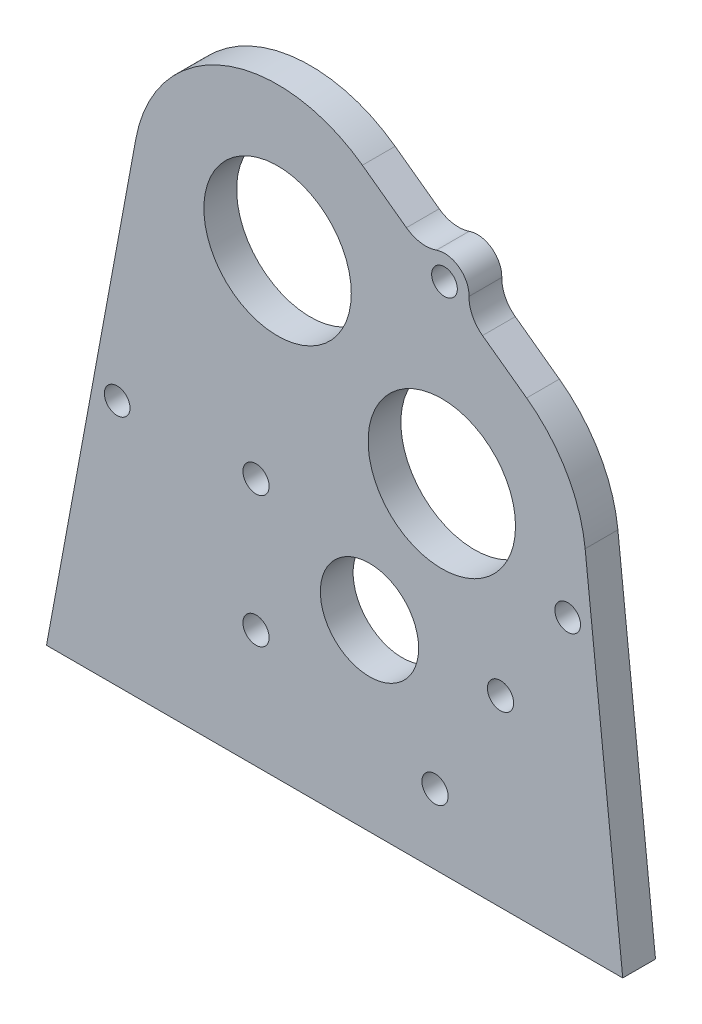
ISO-10303-21;
HEADER;
FILE_DESCRIPTION(('STEP AP214'),'2;1');
FILE_NAME('part.step','',(''),(''),'','','');
FILE_SCHEMA(('AUTOMOTIVE_DESIGN { 1 0 10303 214 1 1 1 1 }'));
ENDSEC;
DATA;
#1=APPLICATION_CONTEXT('core data for automotive mechanical design processes');
#2=APPLICATION_PROTOCOL_DEFINITION('international standard','automotive_design',2000,#1);
#3=PRODUCT_CONTEXT('',#1,'mechanical');
#4=PRODUCT('Part','Part','',(#3));
#5=PRODUCT_RELATED_PRODUCT_CATEGORY('part','',(#4));
#6=PRODUCT_DEFINITION_FORMATION('','',#4);
#7=PRODUCT_DEFINITION_CONTEXT('part definition',#1,'design');
#8=PRODUCT_DEFINITION('design','',#6,#7);
#9=PRODUCT_DEFINITION_SHAPE('','',#8);
#10=(LENGTH_UNIT() NAMED_UNIT(*) SI_UNIT(.MILLI.,.METRE.));
#11=(NAMED_UNIT(*) PLANE_ANGLE_UNIT() SI_UNIT($,.RADIAN.));
#12=(NAMED_UNIT(*) SI_UNIT($,.STERADIAN.) SOLID_ANGLE_UNIT());
#13=UNCERTAINTY_MEASURE_WITH_UNIT(LENGTH_MEASURE(1.E-05),#10,'distance_accuracy_value','');
#14=(GEOMETRIC_REPRESENTATION_CONTEXT(3) GLOBAL_UNCERTAINTY_ASSIGNED_CONTEXT((#13)) GLOBAL_UNIT_ASSIGNED_CONTEXT((#10,
#11,#12)) REPRESENTATION_CONTEXT('',''));
#15=CARTESIAN_POINT('',(0.,0.,0.));
#16=DIRECTION('',(0.,0.,1.));
#17=DIRECTION('',(1.,0.,0.));
#18=AXIS2_PLACEMENT_3D('',#15,#16,#17);
#19=CARTESIAN_POINT('',(0.,0.,-3.175));
#20=DIRECTION('',(0.,0.,1.));
#21=DIRECTION('',(1.,0.,0.));
#22=AXIS2_PLACEMENT_3D('',#19,#20,#21);
#23=PLANE('',#22);
#24=CARTESIAN_POINT('',(357.900203683853,107.288954743875,-3.175));
#25=DIRECTION('',(0.,0.,1.));
#26=DIRECTION('',(1.,0.,0.));
#27=AXIS2_PLACEMENT_3D('',#24,#25,#26);
#28=CIRCLE('',#27,2.54000000000001);
#29=CARTESIAN_POINT('',(360.440203683853,107.288954743875,-3.175));
#30=VERTEX_POINT('',#29);
#31=EDGE_CURVE('E529',#30,#30,#28,.T.);
#32=ORIENTED_EDGE('',*,*,#31,.T.);
#33=EDGE_LOOP('',(#32));
#34=FACE_BOUND('',#33,.T.);
#35=CARTESIAN_POINT('',(323.203158427728,141.986,-3.175));
#36=DIRECTION('',(0.,0.,1.));
#37=DIRECTION('',(1.,0.,0.));
#38=AXIS2_PLACEMENT_3D('',#35,#36,#37);
#39=CIRCLE('',#38,2.54000000000001);
#40=CARTESIAN_POINT('',(325.743158427728,141.986,-3.175));
#41=VERTEX_POINT('',#40);
#42=EDGE_CURVE('E515',#41,#41,#39,.T.);
#43=ORIENTED_EDGE('',*,*,#42,.T.);
#44=EDGE_LOOP('',(#43));
#45=FACE_BOUND('',#44,.T.);
#46=CARTESIAN_POINT('',(345.200203683853,129.286,-3.175));
#47=DIRECTION('',(0.,0.,1.));
#48=DIRECTION('',(1.,0.,0.));
#49=AXIS2_PLACEMENT_3D('',#46,#47,#48);
#50=CIRCLE('',#49,9.52500000000002);
#51=CARTESIAN_POINT('',(354.725203683853,129.286,-3.175));
#52=VERTEX_POINT('',#51);
#53=EDGE_CURVE('E520',#52,#52,#50,.T.);
#54=ORIENTED_EDGE('',*,*,#53,.T.);
#55=EDGE_LOOP('',(#54));
#56=FACE_BOUND('',#55,.T.);
#57=CARTESIAN_POINT('',(359.220787339553,159.181545386454,-3.175));
#58=DIRECTION('',(0.,0.,1.));
#59=DIRECTION('',(1.,0.,0.));
#60=AXIS2_PLACEMENT_3D('',#57,#58,#59);
#61=CIRCLE('',#60,14.2875);
#62=CARTESIAN_POINT('',(373.508287339553,159.181545386454,-3.175));
#63=VERTEX_POINT('',#62);
#64=EDGE_CURVE('E535',#63,#63,#61,.T.);
#65=ORIENTED_EDGE('',*,*,#64,.T.);
#66=EDGE_LOOP('',(#65));
#67=FACE_BOUND('',#66,.T.);
#68=CARTESIAN_POINT('',(359.736930032377,193.355752351951,-3.175));
#69=DIRECTION('',(0.,0.,1.));
#70=DIRECTION('',(1.,0.,0.));
#71=AXIS2_PLACEMENT_3D('',#68,#69,#70);
#72=CIRCLE('',#71,2.48919999999995);
#73=CARTESIAN_POINT('',(362.226130032377,193.355752351951,-3.175));
#74=VERTEX_POINT('',#73);
#75=EDGE_CURVE('E582',#74,#74,#72,.T.);
#76=ORIENTED_EDGE('',*,*,#75,.T.);
#77=EDGE_LOOP('',(#76));
#78=FACE_BOUND('',#77,.T.);
#79=CARTESIAN_POINT('',(323.203158427728,116.586,-3.175));
#80=DIRECTION('',(0.,0.,1.));
#81=DIRECTION('',(1.,0.,0.));
#82=AXIS2_PLACEMENT_3D('',#79,#80,#81);
#83=CIRCLE('',#82,2.54000000000001);
#84=CARTESIAN_POINT('',(325.743158427728,116.586,-3.175));
#85=VERTEX_POINT('',#84);
#86=EDGE_CURVE('E579',#85,#85,#83,.T.);
#87=ORIENTED_EDGE('',*,*,#86,.T.);
#88=EDGE_LOOP('',(#87));
#89=FACE_BOUND('',#88,.T.);
#90=CARTESIAN_POINT('',(370.600203683853,129.286,-3.175));
#91=DIRECTION('',(0.,0.,1.));
#92=DIRECTION('',(1.,0.,0.));
#93=AXIS2_PLACEMENT_3D('',#90,#91,#92);
#94=CIRCLE('',#93,2.54000000000001);
#95=CARTESIAN_POINT('',(373.140203683853,129.286,-3.175));
#96=VERTEX_POINT('',#95);
#97=EDGE_CURVE('E572',#96,#96,#94,.T.);
#98=ORIENTED_EDGE('',*,*,#97,.T.);
#99=EDGE_LOOP('',(#98));
#100=FACE_BOUND('',#99,.T.);
#101=CARTESIAN_POINT('',(383.622054767401,148.927754779996,-3.175));
#102=DIRECTION('',(0.,0.,1.));
#103=DIRECTION('',(1.,0.,0.));
#104=AXIS2_PLACEMENT_3D('',#101,#102,#103);
#105=CIRCLE('',#104,2.48919999999995);
#106=CARTESIAN_POINT('',(386.111254767401,148.927754779996,-3.175));
#107=VERTEX_POINT('',#106);
#108=EDGE_CURVE('E573',#107,#107,#105,.T.);
#109=ORIENTED_EDGE('',*,*,#108,.T.);
#110=EDGE_LOOP('',(#109));
#111=FACE_BOUND('',#110,.T.);
#112=CARTESIAN_POINT('',(327.382606343257,182.340283064642,-3.175));
#113=DIRECTION('',(0.,0.,1.));
#114=DIRECTION('',(1.,0.,0.));
#115=AXIS2_PLACEMENT_3D('',#112,#113,#114);
#116=CIRCLE('',#115,14.2875000000001);
#117=CARTESIAN_POINT('',(341.670106343257,182.340283064642,-3.175));
#118=VERTEX_POINT('',#117);
#119=EDGE_CURVE('E209',#118,#118,#116,.T.);
#120=ORIENTED_EDGE('',*,*,#119,.T.);
#121=EDGE_LOOP('',(#120));
#122=FACE_BOUND('',#121,.T.);
#123=CARTESIAN_POINT('',(359.736930032377,193.355752351951,-3.175));
#124=DIRECTION('',(0.,0.,1.));
#125=DIRECTION('',(1.,0.,0.));
#126=AXIS2_PLACEMENT_3D('',#123,#124,#125);
#127=CIRCLE('',#126,4.76250000000001);
#128=CARTESIAN_POINT('',(364.498416944781,193.257524896504,-3.175));
#129=VERTEX_POINT('',#128);
#130=CARTESIAN_POINT('',(358.177111923409,197.855571650205,-3.175));
#131=VERTEX_POINT('',#130);
#132=EDGE_CURVE('E187',#129,#131,#127,.T.);
#133=ORIENTED_EDGE('',*,*,#132,.F.);
#134=CARTESIAN_POINT('',(370.84706616132,193.126554955907,-3.175));
#135=DIRECTION('',(0.,0.,1.));
#136=DIRECTION('',(1.,0.,0.));
#137=AXIS2_PLACEMENT_3D('',#134,#135,#136);
#138=CIRCLE('',#137,6.35);
#139=CARTESIAN_POINT('',(367.111785890645,187.991364472633,-3.175));
#140=VERTEX_POINT('',#139);
#141=EDGE_CURVE('E88',#129,#140,#138,.T.);
#142=ORIENTED_EDGE('',*,*,#141,.T.);
#143=DIRECTION('',(0.80869141468874,-0.588233113492198,0.));
#144=VECTOR('',#143,1.);
#145=CARTESIAN_POINT('',(216.454674820426,297.577666373321,-3.175));
#146=LINE('',#145,#144);
#147=CARTESIAN_POINT('',(375.656020530525,181.776383512857,-3.175));
#148=VERTEX_POINT('',#147);
#149=EDGE_CURVE('E210',#140,#148,#146,.T.);
#150=ORIENTED_EDGE('',*,*,#149,.T.);
#151=CARTESIAN_POINT('',(359.220787339553,159.181545386454,-3.175));
#152=DIRECTION('',(0.,0.,1.));
#153=DIRECTION('',(1.,0.,0.));
#154=AXIS2_PLACEMENT_3D('',#151,#152,#153);
#155=CIRCLE('',#154,27.94);
#156=CARTESIAN_POINT('',(387.00351783802,162.141863958766,-3.175));
#157=VERTEX_POINT('',#156);
#158=EDGE_CURVE('E221',#157,#148,#155,.T.);
#159=ORIENTED_EDGE('',*,*,#158,.F.);
#160=DIRECTION('',(-0.105952704807169,0.994371170310184,0.));
#161=VECTOR('',#160,1.);
#162=CARTESIAN_POINT('',(399.741695074354,42.5934651787206,-3.175));
#163=LINE('',#162,#161);
#164=CARTESIAN_POINT('',(394.293397165363,93.726,-3.175));
#165=VERTEX_POINT('',#164);
#166=EDGE_CURVE('E218',#165,#157,#163,.T.);
#167=ORIENTED_EDGE('',*,*,#166,.F.);
#168=DIRECTION('',(1.,0.,0.));
#169=VECTOR('',#168,1.);
#170=CARTESIAN_POINT('',(0.,93.726,-3.175));
#171=LINE('',#170,#169);
#172=CARTESIAN_POINT('',(282.588037109009,93.726,-3.175));
#173=VERTEX_POINT('',#172);
#174=EDGE_CURVE('E215',#173,#165,#171,.T.);
#175=ORIENTED_EDGE('',*,*,#174,.F.);
#176=DIRECTION('',(0.181779511053592,0.983339315476157,0.));
#177=VECTOR('',#176,1.);
#178=CARTESIAN_POINT('',(256.496646574376,-47.4158149352533,-3.175));
#179=LINE('',#178,#177);
#180=CARTESIAN_POINT('',(299.908105868854,187.419202603479,-3.175));
#181=VERTEX_POINT('',#180);
#182=EDGE_CURVE('E212',#173,#181,#179,.T.);
#183=ORIENTED_EDGE('',*,*,#182,.T.);
#184=CARTESIAN_POINT('',(327.382606343257,182.340283064642,-3.175));
#185=DIRECTION('',(0.,0.,1.));
#186=DIRECTION('',(1.,0.,0.));
#187=AXIS2_PLACEMENT_3D('',#184,#185,#186);
#188=CIRCLE('',#187,27.94);
#189=CARTESIAN_POINT('',(343.817839534229,204.935121191045,-3.175));
#190=VERTEX_POINT('',#189);
#191=EDGE_CURVE('E208',#190,#181,#188,.T.);
#192=ORIENTED_EDGE('',*,*,#191,.F.);
#193=CARTESIAN_POINT('',(352.36207417411,198.720140231269,-3.175));
#194=VERTEX_POINT('',#193);
#195=EDGE_CURVE('E163',#190,#194,#146,.T.);
#196=ORIENTED_EDGE('',*,*,#195,.T.);
#197=CARTESIAN_POINT('',(356.097354444785,203.855330714543,-3.175));
#198=DIRECTION('',(0.,0.,1.));
#199=DIRECTION('',(1.,0.,0.));
#200=AXIS2_PLACEMENT_3D('',#197,#198,#199);
#201=CIRCLE('',#200,6.35);
#202=EDGE_CURVE('E243',#194,#131,#201,.T.);
#203=ORIENTED_EDGE('',*,*,#202,.T.);
#204=EDGE_LOOP('',(#133,#142,#150,#159,#167,#175,#183,#192,#196,#203));
#205=FACE_BOUND('',#204,.T.);
#206=CARTESIAN_POINT('',(296.287104949656,141.632015054224,-3.175));
#207=DIRECTION('',(0.,0.,1.));
#208=DIRECTION('',(1.,0.,0.));
#209=AXIS2_PLACEMENT_3D('',#206,#207,#208);
#210=CIRCLE('',#209,2.48919999999995);
#211=CARTESIAN_POINT('',(298.776304949656,141.632015054224,-3.175));
#212=VERTEX_POINT('',#211);
#213=EDGE_CURVE('E183',#212,#212,#210,.T.);
#214=ORIENTED_EDGE('',*,*,#213,.T.);
#215=EDGE_LOOP('',(#214));
#216=FACE_BOUND('',#215,.T.);
#217=ADVANCED_FACE('F80',(#34,#45,#56,#67,#78,#89,#100,#111,#122,#205,#216),#23,.F.);
#218=CARTESIAN_POINT('',(359.736930032377,193.355752351951,3.175));
#219=DIRECTION('',(0.,0.,-1.));
#220=DIRECTION('',(-1.,0.,0.));
#221=AXIS2_PLACEMENT_3D('',#218,#219,#220);
#222=CYLINDRICAL_SURFACE('',#221,4.76250000000001);
#223=ORIENTED_EDGE('',*,*,#132,.T.);
#224=DIRECTION('',(0.,0.,-1.));
#225=VECTOR('',#224,1.);
#226=CARTESIAN_POINT('',(358.177111923409,197.855571650205,3.175));
#227=LINE('',#226,#225);
#228=CARTESIAN_POINT('',(358.177111923409,197.855571650205,3.175));
#229=VERTEX_POINT('',#228);
#230=EDGE_CURVE('E240',#131,#229,#227,.F.);
#231=ORIENTED_EDGE('',*,*,#230,.T.);
#232=CARTESIAN_POINT('',(359.736930032377,193.355752351951,3.175));
#233=DIRECTION('',(0.,0.,1.));
#234=DIRECTION('',(1.,0.,0.));
#235=AXIS2_PLACEMENT_3D('',#232,#233,#234);
#236=CIRCLE('',#235,4.76250000000001);
#237=CARTESIAN_POINT('',(364.498416944781,193.257524896504,3.175));
#238=VERTEX_POINT('',#237);
#239=EDGE_CURVE('E190',#238,#229,#236,.T.);
#240=ORIENTED_EDGE('',*,*,#239,.F.);
#241=DIRECTION('',(0.,0.,-1.));
#242=VECTOR('',#241,1.);
#243=CARTESIAN_POINT('',(364.498416944781,193.257524896504,3.175));
#244=LINE('',#243,#242);
#245=EDGE_CURVE('E237',#238,#129,#244,.T.);
#246=ORIENTED_EDGE('',*,*,#245,.T.);
#247=EDGE_LOOP('',(#223,#231,#240,#246));
#248=FACE_BOUND('',#247,.T.);
#249=ADVANCED_FACE('F249',(#248),#222,.T.);
#250=CARTESIAN_POINT('',(0.,0.,3.175));
#251=DIRECTION('',(0.,0.,1.));
#252=DIRECTION('',(1.,0.,0.));
#253=AXIS2_PLACEMENT_3D('',#250,#251,#252);
#254=PLANE('',#253);
#255=CARTESIAN_POINT('',(357.900203683853,107.288954743875,3.175));
#256=DIRECTION('',(0.,0.,1.));
#257=DIRECTION('',(1.,0.,0.));
#258=AXIS2_PLACEMENT_3D('',#255,#256,#257);
#259=CIRCLE('',#258,2.54000000000001);
#260=CARTESIAN_POINT('',(360.440203683853,107.288954743875,3.175));
#261=VERTEX_POINT('',#260);
#262=EDGE_CURVE('E525',#261,#261,#259,.T.);
#263=ORIENTED_EDGE('',*,*,#262,.F.);
#264=EDGE_LOOP('',(#263));
#265=FACE_BOUND('',#264,.T.);
#266=CARTESIAN_POINT('',(323.203158427728,141.986,3.175));
#267=DIRECTION('',(0.,0.,1.));
#268=DIRECTION('',(1.,0.,0.));
#269=AXIS2_PLACEMENT_3D('',#266,#267,#268);
#270=CIRCLE('',#269,2.54000000000001);
#271=CARTESIAN_POINT('',(325.743158427728,141.986,3.175));
#272=VERTEX_POINT('',#271);
#273=EDGE_CURVE('E518',#272,#272,#270,.T.);
#274=ORIENTED_EDGE('',*,*,#273,.F.);
#275=EDGE_LOOP('',(#274));
#276=FACE_BOUND('',#275,.T.);
#277=CARTESIAN_POINT('',(345.200203683853,129.286,3.175));
#278=DIRECTION('',(0.,0.,1.));
#279=DIRECTION('',(1.,0.,0.));
#280=AXIS2_PLACEMENT_3D('',#277,#278,#279);
#281=CIRCLE('',#280,9.52500000000002);
#282=CARTESIAN_POINT('',(354.725203683853,129.286,3.175));
#283=VERTEX_POINT('',#282);
#284=EDGE_CURVE('E523',#283,#283,#281,.T.);
#285=ORIENTED_EDGE('',*,*,#284,.F.);
#286=EDGE_LOOP('',(#285));
#287=FACE_BOUND('',#286,.T.);
#288=CARTESIAN_POINT('',(359.220787339553,159.181545386454,3.175));
#289=DIRECTION('',(0.,0.,1.));
#290=DIRECTION('',(1.,0.,0.));
#291=AXIS2_PLACEMENT_3D('',#288,#289,#290);
#292=CIRCLE('',#291,14.2875);
#293=CARTESIAN_POINT('',(373.508287339553,159.181545386454,3.175));
#294=VERTEX_POINT('',#293);
#295=EDGE_CURVE('E538',#294,#294,#292,.T.);
#296=ORIENTED_EDGE('',*,*,#295,.F.);
#297=EDGE_LOOP('',(#296));
#298=FACE_BOUND('',#297,.T.);
#299=CARTESIAN_POINT('',(359.736930032377,193.355752351951,3.175));
#300=DIRECTION('',(0.,0.,1.));
#301=DIRECTION('',(1.,0.,0.));
#302=AXIS2_PLACEMENT_3D('',#299,#300,#301);
#303=CIRCLE('',#302,2.48919999999995);
#304=CARTESIAN_POINT('',(362.226130032377,193.355752351951,3.175));
#305=VERTEX_POINT('',#304);
#306=EDGE_CURVE('E532',#305,#305,#303,.T.);
#307=ORIENTED_EDGE('',*,*,#306,.F.);
#308=EDGE_LOOP('',(#307));
#309=FACE_BOUND('',#308,.T.);
#310=CARTESIAN_POINT('',(323.203158427728,116.586,3.175));
#311=DIRECTION('',(0.,0.,1.));
#312=DIRECTION('',(1.,0.,0.));
#313=AXIS2_PLACEMENT_3D('',#310,#311,#312);
#314=CIRCLE('',#313,2.54000000000001);
#315=CARTESIAN_POINT('',(325.743158427728,116.586,3.175));
#316=VERTEX_POINT('',#315);
#317=EDGE_CURVE('E563',#316,#316,#314,.T.);
#318=ORIENTED_EDGE('',*,*,#317,.F.);
#319=EDGE_LOOP('',(#318));
#320=FACE_BOUND('',#319,.T.);
#321=CARTESIAN_POINT('',(370.600203683853,129.286,3.175));
#322=DIRECTION('',(0.,0.,1.));
#323=DIRECTION('',(1.,0.,0.));
#324=AXIS2_PLACEMENT_3D('',#321,#322,#323);
#325=CIRCLE('',#324,2.54000000000001);
#326=CARTESIAN_POINT('',(373.140203683853,129.286,3.175));
#327=VERTEX_POINT('',#326);
#328=EDGE_CURVE('E567',#327,#327,#325,.T.);
#329=ORIENTED_EDGE('',*,*,#328,.F.);
#330=EDGE_LOOP('',(#329));
#331=FACE_BOUND('',#330,.T.);
#332=CARTESIAN_POINT('',(383.622054767401,148.927754779996,3.175));
#333=DIRECTION('',(0.,0.,1.));
#334=DIRECTION('',(1.,0.,0.));
#335=AXIS2_PLACEMENT_3D('',#332,#333,#334);
#336=CIRCLE('',#335,2.48919999999995);
#337=CARTESIAN_POINT('',(386.111254767401,148.927754779996,3.175));
#338=VERTEX_POINT('',#337);
#339=EDGE_CURVE('E570',#338,#338,#336,.T.);
#340=ORIENTED_EDGE('',*,*,#339,.F.);
#341=EDGE_LOOP('',(#340));
#342=FACE_BOUND('',#341,.T.);
#343=CARTESIAN_POINT('',(327.382606343257,182.340283064642,3.175));
#344=DIRECTION('',(0.,0.,1.));
#345=DIRECTION('',(1.,0.,0.));
#346=AXIS2_PLACEMENT_3D('',#343,#344,#345);
#347=CIRCLE('',#346,14.2875000000001);
#348=CARTESIAN_POINT('',(341.670106343257,182.340283064642,3.175));
#349=VERTEX_POINT('',#348);
#350=EDGE_CURVE('E540',#349,#349,#347,.T.);
#351=ORIENTED_EDGE('',*,*,#350,.F.);
#352=EDGE_LOOP('',(#351));
#353=FACE_BOUND('',#352,.T.);
#354=DIRECTION('',(0.80869141468874,-0.588233113492198,0.));
#355=VECTOR('',#354,1.);
#356=CARTESIAN_POINT('',(216.454674820426,297.577666373321,3.175));
#357=LINE('',#356,#355);
#358=CARTESIAN_POINT('',(367.111785890645,187.991364472633,3.175));
#359=VERTEX_POINT('',#358);
#360=CARTESIAN_POINT('',(375.656020530525,181.776383512857,3.175));
#361=VERTEX_POINT('',#360);
#362=EDGE_CURVE('E185',#359,#361,#357,.T.);
#363=ORIENTED_EDGE('',*,*,#362,.F.);
#364=CARTESIAN_POINT('',(370.84706616132,193.126554955907,3.175));
#365=DIRECTION('',(0.,0.,1.));
#366=DIRECTION('',(1.,0.,0.));
#367=AXIS2_PLACEMENT_3D('',#364,#365,#366);
#368=CIRCLE('',#367,6.35);
#369=EDGE_CURVE('E12',#359,#238,#368,.F.);
#370=ORIENTED_EDGE('',*,*,#369,.T.);
#371=ORIENTED_EDGE('',*,*,#239,.T.);
#372=CARTESIAN_POINT('',(356.097354444785,203.855330714543,3.175));
#373=DIRECTION('',(0.,0.,1.));
#374=DIRECTION('',(1.,0.,0.));
#375=AXIS2_PLACEMENT_3D('',#372,#373,#374);
#376=CIRCLE('',#375,6.35);
#377=CARTESIAN_POINT('',(352.36207417411,198.720140231269,3.175));
#378=VERTEX_POINT('',#377);
#379=EDGE_CURVE('E182',#229,#378,#376,.F.);
#380=ORIENTED_EDGE('',*,*,#379,.T.);
#381=CARTESIAN_POINT('',(343.817839534229,204.935121191045,3.175));
#382=VERTEX_POINT('',#381);
#383=EDGE_CURVE('E160',#382,#378,#357,.T.);
#384=ORIENTED_EDGE('',*,*,#383,.F.);
#385=CARTESIAN_POINT('',(327.382606343257,182.340283064642,3.175));
#386=DIRECTION('',(0.,0.,1.));
#387=DIRECTION('',(1.,0.,0.));
#388=AXIS2_PLACEMENT_3D('',#385,#386,#387);
#389=CIRCLE('',#388,27.94);
#390=CARTESIAN_POINT('',(299.908105868854,187.419202603479,3.175));
#391=VERTEX_POINT('',#390);
#392=EDGE_CURVE('E171',#382,#391,#389,.T.);
#393=ORIENTED_EDGE('',*,*,#392,.T.);
#394=DIRECTION('',(0.181779511053592,0.983339315476157,0.));
#395=VECTOR('',#394,1.);
#396=CARTESIAN_POINT('',(256.496646574376,-47.4158149352533,3.175));
#397=LINE('',#396,#395);
#398=CARTESIAN_POINT('',(282.588037109009,93.726,3.175));
#399=VERTEX_POINT('',#398);
#400=EDGE_CURVE('E176',#399,#391,#397,.T.);
#401=ORIENTED_EDGE('',*,*,#400,.F.);
#402=DIRECTION('',(1.,0.,0.));
#403=VECTOR('',#402,1.);
#404=CARTESIAN_POINT('',(0.,93.726,3.175));
#405=LINE('',#404,#403);
#406=CARTESIAN_POINT('',(394.293397165363,93.726,3.175));
#407=VERTEX_POINT('',#406);
#408=EDGE_CURVE('E200',#399,#407,#405,.T.);
#409=ORIENTED_EDGE('',*,*,#408,.T.);
#410=DIRECTION('',(-0.105952704807169,0.994371170310184,0.));
#411=VECTOR('',#410,1.);
#412=CARTESIAN_POINT('',(399.741695074354,42.5934651787206,3.175));
#413=LINE('',#412,#411);
#414=CARTESIAN_POINT('',(387.00351783802,162.141863958766,3.175));
#415=VERTEX_POINT('',#414);
#416=EDGE_CURVE('E196',#407,#415,#413,.T.);
#417=ORIENTED_EDGE('',*,*,#416,.T.);
#418=CARTESIAN_POINT('',(359.220787339553,159.181545386454,3.175));
#419=DIRECTION('',(0.,0.,1.));
#420=DIRECTION('',(1.,0.,0.));
#421=AXIS2_PLACEMENT_3D('',#418,#419,#420);
#422=CIRCLE('',#421,27.94);
#423=EDGE_CURVE('E191',#415,#361,#422,.T.);
#424=ORIENTED_EDGE('',*,*,#423,.T.);
#425=EDGE_LOOP('',(#363,#370,#371,#380,#384,#393,#401,#409,#417,#424));
#426=FACE_BOUND('',#425,.T.);
#427=CARTESIAN_POINT('',(296.287104949656,141.632015054224,3.175));
#428=DIRECTION('',(0.,0.,1.));
#429=DIRECTION('',(1.,0.,0.));
#430=AXIS2_PLACEMENT_3D('',#427,#428,#429);
#431=CIRCLE('',#430,2.48919999999995);
#432=CARTESIAN_POINT('',(298.776304949656,141.632015054224,3.175));
#433=VERTEX_POINT('',#432);
#434=EDGE_CURVE('E194',#433,#433,#431,.T.);
#435=ORIENTED_EDGE('',*,*,#434,.F.);
#436=EDGE_LOOP('',(#435));
#437=FACE_BOUND('',#436,.T.);
#438=ADVANCED_FACE('F178',(#265,#276,#287,#298,#309,#320,#331,#342,#353,#426,#437),#254,.T.);
#439=CARTESIAN_POINT('',(216.454674820426,297.577666373321,3.175));
#440=DIRECTION('',(0.588233113492198,0.80869141468874,0.));
#441=DIRECTION('',(-0.80869141468874,0.588233113492198,0.));
#442=AXIS2_PLACEMENT_3D('',#439,#440,#441);
#443=PLANE('',#442);
#444=ORIENTED_EDGE('',*,*,#383,.T.);
#445=DIRECTION('',(0.,0.,-1.));
#446=VECTOR('',#445,1.);
#447=CARTESIAN_POINT('',(352.36207417411,198.720140231269,3.175));
#448=LINE('',#447,#446);
#449=EDGE_CURVE('E167',#378,#194,#448,.T.);
#450=ORIENTED_EDGE('',*,*,#449,.T.);
#451=ORIENTED_EDGE('',*,*,#195,.F.);
#452=DIRECTION('',(0.,0.,-1.));
#453=VECTOR('',#452,1.);
#454=CARTESIAN_POINT('',(343.817839534229,204.935121191045,3.175));
#455=LINE('',#454,#453);
#456=EDGE_CURVE('E155',#382,#190,#455,.T.);
#457=ORIENTED_EDGE('',*,*,#456,.F.);
#458=EDGE_LOOP('',(#444,#450,#451,#457));
#459=FACE_BOUND('',#458,.T.);
#460=ADVANCED_FACE('F157',(#459),#443,.T.);
#461=CARTESIAN_POINT('',(327.382606343257,182.340283064642,3.175));
#462=DIRECTION('',(0.,0.,-1.));
#463=DIRECTION('',(-1.,0.,0.));
#464=AXIS2_PLACEMENT_3D('',#461,#462,#463);
#465=CYLINDRICAL_SURFACE('',#464,27.94);
#466=ORIENTED_EDGE('',*,*,#191,.T.);
#467=DIRECTION('',(0.,0.,-1.));
#468=VECTOR('',#467,1.);
#469=CARTESIAN_POINT('',(299.908105868854,187.419202603479,3.175));
#470=LINE('',#469,#468);
#471=EDGE_CURVE('E168',#391,#181,#470,.T.);
#472=ORIENTED_EDGE('',*,*,#471,.F.);
#473=ORIENTED_EDGE('',*,*,#392,.F.);
#474=ORIENTED_EDGE('',*,*,#456,.T.);
#475=EDGE_LOOP('',(#466,#472,#473,#474));
#476=FACE_BOUND('',#475,.T.);
#477=ADVANCED_FACE('F172',(#476),#465,.T.);
#478=CARTESIAN_POINT('',(256.496646574376,-47.4158149352533,3.175));
#479=DIRECTION('',(-0.983339315476157,0.181779511053592,0.));
#480=DIRECTION('',(-0.181779511053592,-0.983339315476157,0.));
#481=AXIS2_PLACEMENT_3D('',#478,#479,#480);
#482=PLANE('',#481);
#483=ORIENTED_EDGE('',*,*,#182,.F.);
#484=DIRECTION('',(0.,0.,-1.));
#485=VECTOR('',#484,1.);
#486=CARTESIAN_POINT('',(282.588037109009,93.726,3.175));
#487=LINE('',#486,#485);
#488=EDGE_CURVE('E233',#399,#173,#487,.T.);
#489=ORIENTED_EDGE('',*,*,#488,.F.);
#490=ORIENTED_EDGE('',*,*,#400,.T.);
#491=ORIENTED_EDGE('',*,*,#471,.T.);
#492=EDGE_LOOP('',(#483,#489,#490,#491));
#493=FACE_BOUND('',#492,.T.);
#494=ADVANCED_FACE('F292',(#493),#482,.T.);
#495=CARTESIAN_POINT('',(0.,93.726,3.175));
#496=DIRECTION('',(0.,1.,0.));
#497=DIRECTION('',(0.,0.,1.));
#498=AXIS2_PLACEMENT_3D('',#495,#496,#497);
#499=PLANE('',#498);
#500=ORIENTED_EDGE('',*,*,#174,.T.);
#501=DIRECTION('',(0.,0.,-1.));
#502=VECTOR('',#501,1.);
#503=CARTESIAN_POINT('',(394.293397165363,93.726,3.175));
#504=LINE('',#503,#502);
#505=EDGE_CURVE('E230',#407,#165,#504,.T.);
#506=ORIENTED_EDGE('',*,*,#505,.F.);
#507=ORIENTED_EDGE('',*,*,#408,.F.);
#508=ORIENTED_EDGE('',*,*,#488,.T.);
#509=EDGE_LOOP('',(#500,#506,#507,#508));
#510=FACE_BOUND('',#509,.T.);
#511=ADVANCED_FACE('F288',(#510),#499,.F.);
#512=CARTESIAN_POINT('',(399.741695074354,42.5934651787206,3.175));
#513=DIRECTION('',(-0.994371170310184,-0.105952704807169,0.));
#514=DIRECTION('',(0.105952704807169,-0.994371170310184,0.));
#515=AXIS2_PLACEMENT_3D('',#512,#513,#514);
#516=PLANE('',#515);
#517=ORIENTED_EDGE('',*,*,#166,.T.);
#518=DIRECTION('',(0.,0.,-1.));
#519=VECTOR('',#518,1.);
#520=CARTESIAN_POINT('',(387.00351783802,162.141863958766,3.175));
#521=LINE('',#520,#519);
#522=EDGE_CURVE('E227',#415,#157,#521,.T.);
#523=ORIENTED_EDGE('',*,*,#522,.F.);
#524=ORIENTED_EDGE('',*,*,#416,.F.);
#525=ORIENTED_EDGE('',*,*,#505,.T.);
#526=EDGE_LOOP('',(#517,#523,#524,#525));
#527=FACE_BOUND('',#526,.T.);
#528=ADVANCED_FACE('F284',(#527),#516,.F.);
#529=CARTESIAN_POINT('',(359.220787339553,159.181545386454,3.175));
#530=DIRECTION('',(0.,0.,-1.));
#531=DIRECTION('',(-1.,0.,0.));
#532=AXIS2_PLACEMENT_3D('',#529,#530,#531);
#533=CYLINDRICAL_SURFACE('',#532,27.94);
#534=ORIENTED_EDGE('',*,*,#158,.T.);
#535=DIRECTION('',(0.,0.,-1.));
#536=VECTOR('',#535,1.);
#537=CARTESIAN_POINT('',(375.656020530525,181.776383512857,3.175));
#538=LINE('',#537,#536);
#539=EDGE_CURVE('E206',#361,#148,#538,.T.);
#540=ORIENTED_EDGE('',*,*,#539,.F.);
#541=ORIENTED_EDGE('',*,*,#423,.F.);
#542=ORIENTED_EDGE('',*,*,#522,.T.);
#543=EDGE_LOOP('',(#534,#540,#541,#542));
#544=FACE_BOUND('',#543,.T.);
#545=ADVANCED_FACE('F281',(#544),#533,.T.);
#546=ORIENTED_EDGE('',*,*,#149,.F.);
#547=DIRECTION('',(0.,0.,-1.));
#548=VECTOR('',#547,1.);
#549=CARTESIAN_POINT('',(367.111785890645,187.991364472633,3.175));
#550=LINE('',#549,#548);
#551=EDGE_CURVE('E95',#140,#359,#550,.F.);
#552=ORIENTED_EDGE('',*,*,#551,.T.);
#553=ORIENTED_EDGE('',*,*,#362,.T.);
#554=ORIENTED_EDGE('',*,*,#539,.T.);
#555=EDGE_LOOP('',(#546,#552,#553,#554));
#556=FACE_BOUND('',#555,.T.);
#557=ADVANCED_FACE('F279',(#556),#443,.T.);
#558=CARTESIAN_POINT('',(296.287104949656,141.632015054224,3.175));
#559=DIRECTION('',(0.,0.,-1.));
#560=DIRECTION('',(-1.,0.,0.));
#561=AXIS2_PLACEMENT_3D('',#558,#559,#560);
#562=CYLINDRICAL_SURFACE('',#561,2.48919999999995);
#563=ORIENTED_EDGE('',*,*,#434,.T.);
#564=EDGE_LOOP('',(#563));
#565=FACE_BOUND('',#564,.T.);
#566=ORIENTED_EDGE('',*,*,#213,.F.);
#567=EDGE_LOOP('',(#566));
#568=FACE_BOUND('',#567,.T.);
#569=ADVANCED_FACE('F274',(#565,#568),#562,.F.);
#570=CARTESIAN_POINT('',(327.382606343257,182.340283064642,-3.175));
#571=DIRECTION('',(0.,0.,1.));
#572=DIRECTION('',(1.,0.,0.));
#573=AXIS2_PLACEMENT_3D('',#570,#571,#572);
#574=CYLINDRICAL_SURFACE('',#573,14.2875000000001);
#575=ORIENTED_EDGE('',*,*,#119,.F.);
#576=EDGE_LOOP('',(#575));
#577=FACE_BOUND('',#576,.T.);
#578=ORIENTED_EDGE('',*,*,#350,.T.);
#579=EDGE_LOOP('',(#578));
#580=FACE_BOUND('',#579,.T.);
#581=ADVANCED_FACE('F273',(#577,#580),#574,.F.);
#582=CARTESIAN_POINT('',(383.622054767401,148.927754779996,-3.175));
#583=DIRECTION('',(0.,0.,1.));
#584=DIRECTION('',(1.,0.,0.));
#585=AXIS2_PLACEMENT_3D('',#582,#583,#584);
#586=CYLINDRICAL_SURFACE('',#585,2.48919999999995);
#587=ORIENTED_EDGE('',*,*,#108,.F.);
#588=EDGE_LOOP('',(#587));
#589=FACE_BOUND('',#588,.T.);
#590=ORIENTED_EDGE('',*,*,#339,.T.);
#591=EDGE_LOOP('',(#590));
#592=FACE_BOUND('',#591,.T.);
#593=ADVANCED_FACE('F332',(#589,#592),#586,.F.);
#594=CARTESIAN_POINT('',(370.600203683853,129.286,-3.175));
#595=DIRECTION('',(0.,0.,1.));
#596=DIRECTION('',(1.,0.,0.));
#597=AXIS2_PLACEMENT_3D('',#594,#595,#596);
#598=CYLINDRICAL_SURFACE('',#597,2.54000000000001);
#599=ORIENTED_EDGE('',*,*,#97,.F.);
#600=EDGE_LOOP('',(#599));
#601=FACE_BOUND('',#600,.T.);
#602=ORIENTED_EDGE('',*,*,#328,.T.);
#603=EDGE_LOOP('',(#602));
#604=FACE_BOUND('',#603,.T.);
#605=ADVANCED_FACE('F342',(#601,#604),#598,.F.);
#606=CARTESIAN_POINT('',(323.203158427728,116.586,-3.175));
#607=DIRECTION('',(0.,0.,1.));
#608=DIRECTION('',(1.,0.,0.));
#609=AXIS2_PLACEMENT_3D('',#606,#607,#608);
#610=CYLINDRICAL_SURFACE('',#609,2.54000000000001);
#611=ORIENTED_EDGE('',*,*,#86,.F.);
#612=EDGE_LOOP('',(#611));
#613=FACE_BOUND('',#612,.T.);
#614=ORIENTED_EDGE('',*,*,#317,.T.);
#615=EDGE_LOOP('',(#614));
#616=FACE_BOUND('',#615,.T.);
#617=ADVANCED_FACE('F352',(#613,#616),#610,.F.);
#618=CARTESIAN_POINT('',(359.736930032377,193.355752351951,-3.175));
#619=DIRECTION('',(0.,0.,1.));
#620=DIRECTION('',(1.,0.,0.));
#621=AXIS2_PLACEMENT_3D('',#618,#619,#620);
#622=CYLINDRICAL_SURFACE('',#621,2.48919999999995);
#623=ORIENTED_EDGE('',*,*,#75,.F.);
#624=EDGE_LOOP('',(#623));
#625=FACE_BOUND('',#624,.T.);
#626=ORIENTED_EDGE('',*,*,#306,.T.);
#627=EDGE_LOOP('',(#626));
#628=FACE_BOUND('',#627,.T.);
#629=ADVANCED_FACE('F362',(#625,#628),#622,.F.);
#630=CARTESIAN_POINT('',(359.220787339553,159.181545386454,-3.175));
#631=DIRECTION('',(0.,0.,1.));
#632=DIRECTION('',(1.,0.,0.));
#633=AXIS2_PLACEMENT_3D('',#630,#631,#632);
#634=CYLINDRICAL_SURFACE('',#633,14.2875);
#635=ORIENTED_EDGE('',*,*,#64,.F.);
#636=EDGE_LOOP('',(#635));
#637=FACE_BOUND('',#636,.T.);
#638=ORIENTED_EDGE('',*,*,#295,.T.);
#639=EDGE_LOOP('',(#638));
#640=FACE_BOUND('',#639,.T.);
#641=ADVANCED_FACE('F372',(#637,#640),#634,.F.);
#642=CARTESIAN_POINT('',(345.200203683853,129.286,-3.175));
#643=DIRECTION('',(0.,0.,1.));
#644=DIRECTION('',(1.,0.,0.));
#645=AXIS2_PLACEMENT_3D('',#642,#643,#644);
#646=CYLINDRICAL_SURFACE('',#645,9.52500000000002);
#647=ORIENTED_EDGE('',*,*,#53,.F.);
#648=EDGE_LOOP('',(#647));
#649=FACE_BOUND('',#648,.T.);
#650=ORIENTED_EDGE('',*,*,#284,.T.);
#651=EDGE_LOOP('',(#650));
#652=FACE_BOUND('',#651,.T.);
#653=ADVANCED_FACE('F382',(#649,#652),#646,.F.);
#654=CARTESIAN_POINT('',(323.203158427728,141.986,-3.175));
#655=DIRECTION('',(0.,0.,1.));
#656=DIRECTION('',(1.,0.,0.));
#657=AXIS2_PLACEMENT_3D('',#654,#655,#656);
#658=CYLINDRICAL_SURFACE('',#657,2.54000000000001);
#659=ORIENTED_EDGE('',*,*,#42,.F.);
#660=EDGE_LOOP('',(#659));
#661=FACE_BOUND('',#660,.T.);
#662=ORIENTED_EDGE('',*,*,#273,.T.);
#663=EDGE_LOOP('',(#662));
#664=FACE_BOUND('',#663,.T.);
#665=ADVANCED_FACE('F261',(#661,#664),#658,.F.);
#666=CARTESIAN_POINT('',(357.900203683853,107.288954743875,-3.175));
#667=DIRECTION('',(0.,0.,1.));
#668=DIRECTION('',(1.,0.,0.));
#669=AXIS2_PLACEMENT_3D('',#666,#667,#668);
#670=CYLINDRICAL_SURFACE('',#669,2.54000000000001);
#671=ORIENTED_EDGE('',*,*,#31,.F.);
#672=EDGE_LOOP('',(#671));
#673=FACE_BOUND('',#672,.T.);
#674=ORIENTED_EDGE('',*,*,#262,.T.);
#675=EDGE_LOOP('',(#674));
#676=FACE_BOUND('',#675,.T.);
#677=ADVANCED_FACE('F254',(#673,#676),#670,.F.);
#678=CARTESIAN_POINT('',(356.097354444785,203.855330714543,3.175));
#679=DIRECTION('',(0.,0.,-1.));
#680=DIRECTION('',(-1.,0.,0.));
#681=AXIS2_PLACEMENT_3D('',#678,#679,#680);
#682=CYLINDRICAL_SURFACE('',#681,6.35);
#683=ORIENTED_EDGE('',*,*,#379,.F.);
#684=ORIENTED_EDGE('',*,*,#230,.F.);
#685=ORIENTED_EDGE('',*,*,#202,.F.);
#686=ORIENTED_EDGE('',*,*,#449,.F.);
#687=EDGE_LOOP('',(#683,#684,#685,#686));
#688=FACE_BOUND('',#687,.T.);
#689=ADVANCED_FACE('F252',(#688),#682,.F.);
#690=CARTESIAN_POINT('',(370.84706616132,193.126554955907,3.175));
#691=DIRECTION('',(0.,0.,-1.));
#692=DIRECTION('',(-1.,0.,0.));
#693=AXIS2_PLACEMENT_3D('',#690,#691,#692);
#694=CYLINDRICAL_SURFACE('',#693,6.35);
#695=ORIENTED_EDGE('',*,*,#369,.F.);
#696=ORIENTED_EDGE('',*,*,#551,.F.);
#697=ORIENTED_EDGE('',*,*,#141,.F.);
#698=ORIENTED_EDGE('',*,*,#245,.F.);
#699=EDGE_LOOP('',(#695,#696,#697,#698));
#700=FACE_BOUND('',#699,.T.);
#701=ADVANCED_FACE('F82',(#700),#694,.F.);
#702=CLOSED_SHELL('',(#217,#249,#438,#460,#477,#494,#511,#528,#545,#557,#569,#581,#593,#605,
#617,#629,#641,#653,#665,#677,#689,#701));
#703=MANIFOLD_SOLID_BREP('B2',#702);
#704=ADVANCED_BREP_SHAPE_REPRESENTATION('',(#18,#703),#14);
#705=SHAPE_DEFINITION_REPRESENTATION(#9,#704);
ENDSEC;
END-ISO-10303-21;
